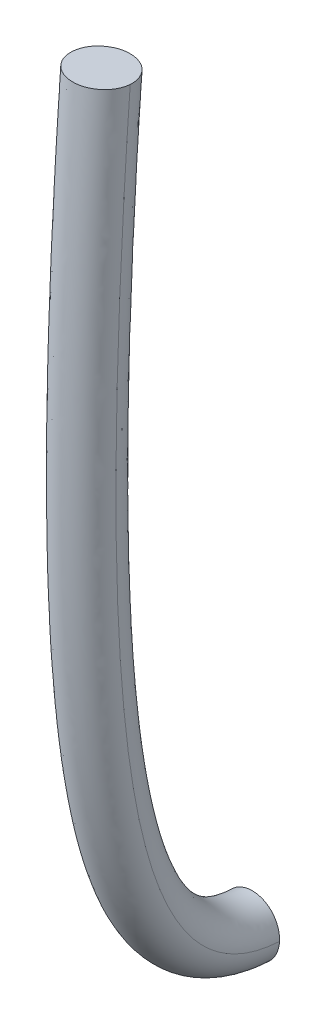
ISO-10303-21;
HEADER;
FILE_DESCRIPTION(('STEP AP214'),'2;1');
FILE_NAME('part.step','',(''),(''),'','','');
FILE_SCHEMA(('AUTOMOTIVE_DESIGN { 1 0 10303 214 1 1 1 1 }'));
ENDSEC;
DATA;
#1=APPLICATION_CONTEXT('core data for automotive mechanical design processes');
#2=APPLICATION_PROTOCOL_DEFINITION('international standard','automotive_design',2000,#1);
#3=PRODUCT_CONTEXT('',#1,'mechanical');
#4=PRODUCT('Part','Part','',(#3));
#5=PRODUCT_RELATED_PRODUCT_CATEGORY('part','',(#4));
#6=PRODUCT_DEFINITION_FORMATION('','',#4);
#7=PRODUCT_DEFINITION_CONTEXT('part definition',#1,'design');
#8=PRODUCT_DEFINITION('design','',#6,#7);
#9=PRODUCT_DEFINITION_SHAPE('','',#8);
#10=(LENGTH_UNIT() NAMED_UNIT(*) SI_UNIT(.MILLI.,.METRE.));
#11=(NAMED_UNIT(*) PLANE_ANGLE_UNIT() SI_UNIT($,.RADIAN.));
#12=(NAMED_UNIT(*) SI_UNIT($,.STERADIAN.) SOLID_ANGLE_UNIT());
#13=UNCERTAINTY_MEASURE_WITH_UNIT(LENGTH_MEASURE(1.E-05),#10,'distance_accuracy_value','');
#14=(GEOMETRIC_REPRESENTATION_CONTEXT(3) GLOBAL_UNCERTAINTY_ASSIGNED_CONTEXT((#13)) GLOBAL_UNIT_ASSIGNED_CONTEXT((#10,
#11,#12)) REPRESENTATION_CONTEXT('',''));
#15=CARTESIAN_POINT('',(0.,0.,0.));
#16=DIRECTION('',(0.,0.,1.));
#17=DIRECTION('',(1.,0.,0.));
#18=AXIS2_PLACEMENT_3D('',#15,#16,#17);
#19=CARTESIAN_POINT('',(11.2371049235898,-7.28816571650413,13.8273298935375));
#20=CARTESIAN_POINT('',(11.2371049235896,-7.2797997466397,13.9789788036062));
#21=CARTESIAN_POINT('',(11.2371049235894,-7.1925133259376,14.2453675982006));
#22=CARTESIAN_POINT('',(11.2371049235895,-6.82521048546997,14.5758359000025));
#23=CARTESIAN_POINT('',(11.2371049235899,-6.16592448523043,14.8229346231481));
#24=CARTESIAN_POINT('',(11.2371049235904,-5.06041775234898,14.9938908384421));
#25=CARTESIAN_POINT('',(11.2371049235907,-3.38308950930502,15.0377976387201));
#26=CARTESIAN_POINT('',(11.2371049235902,-1.84086868438424,14.9634808900407));
#27=CARTESIAN_POINT('',(11.2371049235898,-1.00711458056137,14.9025873102882));
#28=CARTESIAN_POINT('',(11.2662041019751,-7.22780337732114,13.8239999025055));
#29=CARTESIAN_POINT('',(11.2662041019749,-7.21999059608955,13.9656212300474));
#30=CARTESIAN_POINT('',(11.2662041019747,-7.14065188733595,14.2083397741127));
#31=CARTESIAN_POINT('',(11.2662041019748,-6.79718225096702,14.5207767317753));
#32=CARTESIAN_POINT('',(11.2662041019752,-6.15274272714041,14.7636344748142));
#33=CARTESIAN_POINT('',(11.2662041019757,-5.05672270192067,14.9333164200716));
#34=CARTESIAN_POINT('',(11.266204101976,-3.38439002120015,14.9773407944328));
#35=CARTESIAN_POINT('',(11.2662041019755,-1.84433184760095,14.9031186799958));
#36=CARTESIAN_POINT('',(11.2662041019751,-1.01151814356843,14.8422937827354));
#37=CARTESIAN_POINT('',(11.3827049364178,-7.13477011652102,13.8188675645554));
#38=CARTESIAN_POINT('',(11.3827049364176,-7.12780954728994,13.9450409496445));
#39=CARTESIAN_POINT('',(11.3827049364174,-7.06072585194706,14.1512792118558));
#40=CARTESIAN_POINT('',(11.3827049364175,-6.75397895160997,14.4359329395248));
#41=CARTESIAN_POINT('',(11.3827049364179,-6.13242027649786,14.6722480853013));
#42=CARTESIAN_POINT('',(11.3827049364184,-5.0510224207916,14.8399628111613));
#43=CARTESIAN_POINT('',(11.3827049364187,-3.3863895736968,14.8841652911233));
#44=CARTESIAN_POINT('',(11.3827049364182,-1.84967009667295,14.810085666427));
#45=CARTESIAN_POINT('',(11.3827049364178,-1.01830512086634,14.7493665776386));
#46=CARTESIAN_POINT('',(11.6006086827705,-7.18477681596076,13.821626269121));
#47=CARTESIAN_POINT('',(11.6006086827703,-7.17735890579916,13.956089817187));
#48=CARTESIAN_POINT('',(11.6006086827701,-7.10367730897485,14.1819340686278));
#49=CARTESIAN_POINT('',(11.6006086827703,-6.7772105672194,14.4815074345398));
#50=CARTESIAN_POINT('',(11.6006086827707,-6.14335544998786,14.7213510608364));
#51=CARTESIAN_POINT('',(11.6006086827711,-5.05409643294904,14.890129358683));
#52=CARTESIAN_POINT('',(11.6006086827714,-3.38532398400766,14.934241984418));
#53=CARTESIAN_POINT('',(11.600608682771,-1.84679946226505,14.8600921417049));
#54=CARTESIAN_POINT('',(11.6006086827705,-1.01465702414334,14.799316270631));
#55=CARTESIAN_POINT('',(11.6649999999986,-7.31847179552639,13.8290017798951));
#56=CARTESIAN_POINT('',(11.6649999999985,-7.30982729388697,13.9856996012998));
#57=CARTESIAN_POINT('',(11.6649999999983,-7.21856206356238,14.2639753932499));
#58=CARTESIAN_POINT('',(11.6649999999984,-6.83927265079749,14.6035120384916));
#59=CARTESIAN_POINT('',(11.6649999999988,-6.17253016770304,14.8527273660912));
#60=CARTESIAN_POINT('',(11.6649999999992,-5.06226210783719,15.024316706709));
#61=CARTESIAN_POINT('',(11.6649999999995,-3.38242664324033,15.0681581358356));
#62=CARTESIAN_POINT('',(11.6649999999991,-1.83913128396928,14.99378700265));
#63=CARTESIAN_POINT('',(11.6649999999986,-1.00490368664486,14.9328588411016));
#64=CARTESIAN_POINT('',(11.665,-7.38568943191456,13.8327099550486));
#65=CARTESIAN_POINT('',(11.6649999999998,-7.37642950308164,14.0005635497388));
#66=CARTESIAN_POINT('',(11.6649999999996,-7.27630544215443,14.3051956626326));
#67=CARTESIAN_POINT('',(11.6649999999997,-6.87049139059941,14.6648000911306));
#68=CARTESIAN_POINT('',(11.6650000000001,-6.18721819643525,14.9187474121089));
#69=CARTESIAN_POINT('',(11.6650000000006,-5.06638480515216,15.0917606586121));
#70=CARTESIAN_POINT('',(11.6650000000009,-3.38098577287837,15.1354758527534));
#71=CARTESIAN_POINT('',(11.6650000000004,-1.83527381521949,15.0610044224056));
#72=CARTESIAN_POINT('',(11.665,-1.00000001490137,14.9999998509838));
#73=B_SPLINE_SURFACE_WITH_KNOTS('',3,3,((#19,#20,#21,#22,#23,#24,#25,#26,#27),(#28,#29,#30,#31,
#32,#33,#34,#35,#36),(#37,#38,#39,#40,#41,#42,#43,#44,#45),(#46,#47,#48,#49,#50,#51,#52,#53,
#54),(#55,#56,#57,#58,#59,#60,#61,#62,#63),(#64,#65,#66,#67,#68,#69,#70,#71,#72)),.UNSPECIFIED.,
.F.,.F.,.F.,(4,1,1,4),(4,1,1,1,1,1,4),(0.448798950512828,1.34639685153848,2.24399475256414,
3.14159265358979),(0.,0.142857142857143,0.285714285714286,0.428571428571429,0.571428571428571,
0.785714285714286,1.),.UNSPECIFIED.);
#74=CARTESIAN_POINT('',(11.665,-7.38568943191456,13.8327099550486));
#75=CARTESIAN_POINT('',(11.6649999999998,-7.37642950308164,14.0005635497388));
#76=CARTESIAN_POINT('',(11.6649999999996,-7.27630544215443,14.3051956626326));
#77=CARTESIAN_POINT('',(11.6649999999997,-6.87049139059941,14.6648000911306));
#78=CARTESIAN_POINT('',(11.6650000000001,-6.18721819643525,14.9187474121089));
#79=CARTESIAN_POINT('',(11.6650000000006,-5.06638480515216,15.0917606586121));
#80=CARTESIAN_POINT('',(11.6650000000009,-3.38098577287837,15.1354758527534));
#81=CARTESIAN_POINT('',(11.6650000000004,-1.83527381521949,15.0610044224056));
#82=CARTESIAN_POINT('',(11.665,-1.00000001490137,14.9999998509838));
#83=B_SPLINE_CURVE_WITH_KNOTS('',3,(#74,#75,#76,#77,#78,#79,#80,#81,#82),.UNSPECIFIED.,.F.,.F.,
(4,1,1,1,1,1,4),(0.,0.142857142857143,0.285714285714286,0.428571428571429,0.571428571428571,
0.785714285714286,1.),.UNSPECIFIED.);
#84=CARTESIAN_POINT('',(11.665,-7.38568943191456,13.8327099550486));
#85=VERTEX_POINT('',#84);
#86=CARTESIAN_POINT('',(11.665,-1.00000001490137,14.9999998509838));
#87=VERTEX_POINT('',#86);
#88=EDGE_CURVE('E11',#85,#87,#83,.T.);
#89=CARTESIAN_POINT('',(11.665,-7.38568943191456,13.8327099550486));
#90=CARTESIAN_POINT('',(11.6650213517368,-7.41102547336946,13.8341076608363));
#91=CARTESIAN_POINT('',(11.6605260471071,-7.43643406147221,13.8355093687831));
#92=CARTESIAN_POINT('',(11.6435797747782,-7.48437927510819,13.8381543479804));
#93=CARTESIAN_POINT('',(11.631134036319,-7.50691777670614,13.8393977227271));
#94=CARTESIAN_POINT('',(11.5993172085098,-7.54640166593632,13.8415759185828));
#95=CARTESIAN_POINT('',(11.5799575825764,-7.56335622298759,13.8425112455383));
#96=CARTESIAN_POINT('',(11.5369135394507,-7.58996173161371,13.84397898364));
#97=CARTESIAN_POINT('',(11.513258328976,-7.59965986982189,13.844513997917));
#98=CARTESIAN_POINT('',(11.4639943449949,-7.61052238935641,13.8451132472689));
#99=CARTESIAN_POINT('',(11.4383805818065,-7.61166418738589,13.8451762364977));
#100=CARTESIAN_POINT('',(11.388111518271,-7.60564112333084,13.8448439639323));
#101=CARTESIAN_POINT('',(11.363457837558,-7.59846280382561,13.8444479597366));
#102=CARTESIAN_POINT('',(11.3179951823405,-7.57620559150138,13.8432201027906));
#103=CARTESIAN_POINT('',(11.2971918121944,-7.56111530281504,13.842387621368));
#104=CARTESIAN_POINT('',(11.2614934982136,-7.52495356613519,13.8403926977039));
#105=CARTESIAN_POINT('',(11.2466217840351,-7.50385914636031,13.8392289881852));
#106=CARTESIAN_POINT('',(11.2254441169844,-7.45822928099255,13.8367117391103));
#107=CARTESIAN_POINT('',(11.2189695929904,-7.43377282103522,13.8353625569309));
#108=CARTESIAN_POINT('',(11.2152068598672,-7.39652682447253,13.8333078182277));
#109=CARTESIAN_POINT('',(11.2149625619213,-7.38393344720673,13.8326130831672));
#110=CARTESIAN_POINT('',(11.2164976629928,-7.35885875176793,13.8312297949767));
#111=CARTESIAN_POINT('',(11.2182760419248,-7.34637738030605,13.8305412389069));
#112=CARTESIAN_POINT('',(11.2239943307244,-7.32135823772467,13.8291610153842));
#113=CARTESIAN_POINT('',(11.2280220095668,-7.30884017502639,13.8284704351799));
#114=CARTESIAN_POINT('',(11.2383339650418,-7.28477125009541,13.8271426320288));
#115=CARTESIAN_POINT('',(11.2446168141733,-7.27321978170879,13.8265053756426));
#116=CARTESIAN_POINT('',(11.2586120670738,-7.25220999709445,13.8253463351664));
#117=CARTESIAN_POINT('',(11.2661896726497,-7.24266098674344,13.824819547781));
#118=CARTESIAN_POINT('',(11.2827549049498,-7.22485207174111,13.8238370887171));
#119=CARTESIAN_POINT('',(11.2917444260656,-7.21659392920781,13.8233815142489));
#120=CARTESIAN_POINT('',(11.3114953717189,-7.20109430490341,13.8225264511312));
#121=CARTESIAN_POINT('',(11.3223324454482,-7.19394868777554,13.8221322510177));
#122=CARTESIAN_POINT('',(11.3450405271618,-7.18157498141827,13.8214496344763));
#123=CARTESIAN_POINT('',(11.3569100333437,-7.17634416274857,13.8211610674742));
#124=CARTESIAN_POINT('',(11.3813450105981,-7.16811399083132,13.8207070360526));
#125=CARTESIAN_POINT('',(11.3939068135744,-7.16510390182364,13.8205409793765));
#126=CARTESIAN_POINT('',(11.4193704073035,-7.16139691803755,13.8203364773156));
#127=CARTESIAN_POINT('',(11.4322724071987,-7.16070148130752,13.8202981123665));
#128=CARTESIAN_POINT('',(11.457288740886,-7.16145428672986,13.8203396421571));
#129=CARTESIAN_POINT('',(11.46940715121,-7.16278602640014,13.8204131098394));
#130=CARTESIAN_POINT('',(11.4932970110949,-7.16730641013266,13.8206624844909));
#131=CARTESIAN_POINT('',(11.505068279431,-7.17049600666694,13.8208384440047));
#132=CARTESIAN_POINT('',(11.5288787623782,-7.17899189700237,13.8213071342346));
#133=CARTESIAN_POINT('',(11.5408660748202,-7.18444510296073,13.8216079696095));
#134=CARTESIAN_POINT('',(11.563673404834,-7.19736897786271,13.8223209371337));
#135=CARTESIAN_POINT('',(11.5744950584494,-7.20483676624812,13.8227329103722));
#136=CARTESIAN_POINT('',(11.603546695065,-7.22919989306082,13.8240769436702));
#137=CARTESIAN_POINT('',(11.6197605726886,-7.24855818836156,13.8251448769315));
#138=CARTESIAN_POINT('',(11.6453568568894,-7.29145127115832,13.8275111467446));
#139=CARTESIAN_POINT('',(11.6546963115424,-7.31501119396303,13.8288108699282));
#140=CARTESIAN_POINT('',(11.6632711909135,-7.35460568155648,13.8309951671306));
#141=CARTESIAN_POINT('',(11.6649868906916,-7.37013388321011,13.8318518067663));
#142=CARTESIAN_POINT('',(11.665,-7.38568943191456,13.8327099550486));
#143=B_SPLINE_CURVE_WITH_KNOTS('',3,(#89,#90,#91,#92,#93,#94,#95,#96,#97,#98,#99,#100,#101,#102,
#103,#104,#105,#106,#107,#108,#109,#110,#111,#112,#113,#114,#115,#116,#117,#118,#119,#120,#121,
#122,#123,#124,#125,#126,#127,#128,#129,#130,#131,#132,#133,#134,#135,#136,#137,#138,#139,#140,
#141,#142),.UNSPECIFIED.,.T.,.F.,(4,2,2,2,2,2,2,2,2,2,2,2,2,2,2,2,2,2,2,2,2,2,2,2,2,2,4),(0.,
0.0759508765630466,0.151851849308873,0.227627555989026,0.302906124840257,0.378383311495008,
0.453982749710444,0.529691376609874,0.60569365045227,0.680145300255501,0.717869365306532,
0.755574413622481,0.794865355264611,0.83413146985316,0.870582209258705,0.907082279751547,
0.945864762005333,0.984591744679409,1.02313025868803,1.06169304433104,1.09812174529155,
1.13456913870207,1.17388682597308,1.21314858997431,1.2874777840451,1.36226753947678,
1.40889903720405),.UNSPECIFIED.);
#144=CARTESIAN_POINT('',(11.2371049235898,-7.28816571650413,13.8273298935375));
#145=VERTEX_POINT('',#144);
#146=EDGE_CURVE('E45',#145,#85,#143,.T.);
#147=CARTESIAN_POINT('',(11.2371049235898,-7.28816571650413,13.8273298935375));
#148=CARTESIAN_POINT('',(11.2371049235896,-7.2797997466397,13.9789788036062));
#149=CARTESIAN_POINT('',(11.2371049235894,-7.1925133259376,14.2453675982006));
#150=CARTESIAN_POINT('',(11.2371049235895,-6.82521048546997,14.5758359000025));
#151=CARTESIAN_POINT('',(11.2371049235899,-6.16592448523043,14.8229346231481));
#152=CARTESIAN_POINT('',(11.2371049235904,-5.06041775234898,14.9938908384421));
#153=CARTESIAN_POINT('',(11.2371049235907,-3.38308950930502,15.0377976387201));
#154=CARTESIAN_POINT('',(11.2371049235902,-1.84086868438424,14.9634808900407));
#155=CARTESIAN_POINT('',(11.2371049235898,-1.00711458056137,14.9025873102882));
#156=B_SPLINE_CURVE_WITH_KNOTS('',3,(#147,#148,#149,#150,#151,#152,#153,#154,#155),
.UNSPECIFIED.,.F.,.F.,(4,1,1,1,1,1,4),(0.,0.142857142857143,0.285714285714286,0.428571428571429,
0.571428571428571,0.785714285714286,1.),.UNSPECIFIED.);
#157=CARTESIAN_POINT('',(11.2371049235898,-1.00711458056137,14.9025873102882));
#158=VERTEX_POINT('',#157);
#159=EDGE_CURVE('E29',#145,#158,#156,.T.);
#160=CARTESIAN_POINT('',(11.665,-1.00000001490137,14.9999998509838));
#161=CARTESIAN_POINT('',(11.664989069257,-1.00092505034254,14.9873342777264));
#162=CARTESIAN_POINT('',(11.663848928742,-1.001850359016,14.9746649633762));
#163=CARTESIAN_POINT('',(11.659425462962,-1.00367493235908,14.9496829288383));
#164=CARTESIAN_POINT('',(11.6561370713378,-1.00457413020076,14.9373711236579));
#165=CARTESIAN_POINT('',(11.647607059914,-1.0063188635782,14.9134822568936));
#166=CARTESIAN_POINT('',(11.6423711225476,-1.00716454693694,14.9019031713193));
#167=CARTESIAN_POINT('',(11.6300891385912,-1.00878227676623,14.8797532354881));
#168=CARTESIAN_POINT('',(11.6230443601062,-1.00955437430694,14.8691816859795));
#169=CARTESIAN_POINT('',(11.6070374842247,-1.01102510155815,14.8490445075401));
#170=CARTESIAN_POINT('',(11.5980230501599,-1.01172073877358,14.839519851813));
#171=CARTESIAN_POINT('',(11.5783852566193,-1.01297820524407,14.8223026372158));
#172=CARTESIAN_POINT('',(11.5677629829274,-1.01354012414617,14.8146088508996));
#173=CARTESIAN_POINT('',(11.5461093974645,-1.01448288567522,14.8017005722773));
#174=CARTESIAN_POINT('',(11.5351581867197,-1.01487361876511,14.7963506598808));
#175=CARTESIAN_POINT('',(11.5125390719713,-1.01552589678584,14.787419677685));
#176=CARTESIAN_POINT('',(11.5008702067087,-1.01578726400625,14.7838410410946));
#177=CARTESIAN_POINT('',(11.4763880374062,-1.01618718663221,14.7783653056895));
#178=CARTESIAN_POINT('',(11.4635484111283,-1.0163172402786,14.7765846128508));
#179=CARTESIAN_POINT('',(11.4377637334483,-1.0164191768623,14.7751888984698));
#180=CARTESIAN_POINT('',(11.4248188560558,-1.01639128237659,14.7755708294061));
#181=CARTESIAN_POINT('',(11.3992406018496,-1.01616740285514,14.778636184909));
#182=CARTESIAN_POINT('',(11.3866063452266,-1.01597196749224,14.7813120833621));
#183=CARTESIAN_POINT('',(11.3620289221829,-1.01541796968436,14.7888974141592));
#184=CARTESIAN_POINT('',(11.3500861686932,-1.01505931088015,14.7938081658525));
#185=CARTESIAN_POINT('',(11.3278358721695,-1.01422561313129,14.8052231446121));
#186=CARTESIAN_POINT('',(11.3174743964508,-1.0137581205502,14.8116240469663));
#187=CARTESIAN_POINT('',(11.2978624558736,-1.01271191458275,14.8259486854973));
#188=CARTESIAN_POINT('',(11.2886126331452,-1.01213313741152,14.8338732950158));
#189=CARTESIAN_POINT('',(11.2707691231984,-1.01082708383549,14.8517557636317));
#190=CARTESIAN_POINT('',(11.2622872012945,-1.01009162968852,14.8618255922689));
#191=CARTESIAN_POINT('',(11.2472443139223,-1.00852502701184,14.8832754957901));
#192=CARTESIAN_POINT('',(11.2406805294172,-1.00769402144199,14.8946536132694));
#193=CARTESIAN_POINT('',(11.2249108019623,-1.00517402040839,14.9291574347224));
#194=CARTESIAN_POINT('',(11.2185998483193,-1.00338291611532,14.9536812114621));
#195=CARTESIAN_POINT('',(11.2151303433721,-1.00066660076836,14.9908729659459));
#196=CARTESIAN_POINT('',(11.2149849442764,-0.999752500313406,15.0033888175139));
#197=CARTESIAN_POINT('',(11.2166922085396,-0.99793330127797,15.0282972671013));
#198=CARTESIAN_POINT('',(11.2185435732397,-0.997028197232558,15.0406899399465));
#199=CARTESIAN_POINT('',(11.2243964780868,-0.995209128478521,15.0655966057227));
#200=CARTESIAN_POINT('',(11.2284973834539,-0.99429684057041,15.0780876399228));
#201=CARTESIAN_POINT('',(11.2389362572408,-0.992542663595455,15.1021058083018));
#202=CARTESIAN_POINT('',(11.2452739053244,-0.991700764469191,15.1136330802142));
#203=CARTESIAN_POINT('',(11.2594126605321,-0.990164688008278,15.1346650191849));
#204=CARTESIAN_POINT('',(11.2670910744706,-0.989464452645206,15.1442526326899));
#205=CARTESIAN_POINT('',(11.2838843083192,-0.988161973942015,15.162086154193));
#206=CARTESIAN_POINT('',(11.2929996883405,-0.987559768999749,15.1703315364483));
#207=CARTESIAN_POINT('',(11.3128590171333,-0.98644519700304,15.1855922417645));
#208=CARTESIAN_POINT('',(11.3236564048542,-0.985937851071557,15.1925388156751));
#209=CARTESIAN_POINT('',(11.3462967414489,-0.985068017376844,15.204448567336));
#210=CARTESIAN_POINT('',(11.3581393030179,-0.984705476226927,15.2094124760563));
#211=CARTESIAN_POINT('',(11.382246109602,-0.984138155209565,15.2171802280644));
#212=CARTESIAN_POINT('',(11.3944969661488,-0.983930330422163,15.2200257623567));
#213=CARTESIAN_POINT('',(11.4193020972807,-0.983662412965591,15.2236940846954));
#214=CARTESIAN_POINT('',(11.4318564720421,-0.983602369762967,15.2245161954465));
#215=CARTESIAN_POINT('',(11.4572586032347,-0.983633599608907,15.224088596801));
#216=CARTESIAN_POINT('',(11.4701056127997,-0.983728798832261,15.22278513027));
#217=CARTESIAN_POINT('',(11.4953659372665,-0.984082612802076,15.2179407139862));
#218=CARTESIAN_POINT('',(11.5077793754626,-0.984341180685668,15.2144004058791));
#219=CARTESIAN_POINT('',(11.5314502069663,-0.98499874886832,15.2053969908546));
#220=CARTESIAN_POINT('',(11.5427311393556,-0.98539329214593,15.199994909417));
#221=CARTESIAN_POINT('',(11.564264949044,-0.986310602055021,15.1874351140445));
#222=CARTESIAN_POINT('',(11.5745176297513,-0.986833393140665,15.1802770652835));
#223=CARTESIAN_POINT('',(11.593950405898,-0.988010405584494,15.1641614261752));
#224=CARTESIAN_POINT('',(11.603096283974,-0.988667651560121,15.1551624228052));
#225=CARTESIAN_POINT('',(11.6196665976134,-0.990087183508968,15.1357262097812));
#226=CARTESIAN_POINT('',(11.6270911337549,-0.990849463340906,15.1252890842135));
#227=CARTESIAN_POINT('',(11.6462018629208,-0.993218131276973,15.0928573135683));
#228=CARTESIAN_POINT('',(11.6552960705372,-0.994942140778152,15.0692521978487));
#229=CARTESIAN_POINT('',(11.6634285988756,-0.997799967859161,15.0301228665382));
#230=CARTESIAN_POINT('',(11.665013000785,-0.998899798120339,15.0150640048733));
#231=CARTESIAN_POINT('',(11.665,-1.00000001490137,14.9999998509838));
#232=B_SPLINE_CURVE_WITH_KNOTS('',3,(#160,#161,#162,#163,#164,#165,#166,#167,#168,#169,#170,
#171,#172,#173,#174,#175,#176,#177,#178,#179,#180,#181,#182,#183,#184,#185,#186,#187,#188,#189,
#190,#191,#192,#193,#194,#195,#196,#197,#198,#199,#200,#201,#202,#203,#204,#205,#206,#207,#208,
#209,#210,#211,#212,#213,#214,#215,#216,#217,#218,#219,#220,#221,#222,#223,#224,#225,#226,#227,
#228,#229,#230,#231),.UNSPECIFIED.,.T.,.F.,(4,2,2,2,2,2,2,2,2,2,2,2,2,2,2,2,2,2,2,2,2,2,2,2,2,2,
2,2,2,2,2,2,2,2,2,4),(0.,0.0380604694484833,0.0762110249795806,0.114251129285625,
0.152264637692989,0.191448096188545,0.230605210946061,0.267033341893636,0.303511376387559,
0.342223454897622,0.380880994794789,0.419412189209357,0.457966160142759,0.494384704742079,
0.530824185883836,0.570180115105823,0.609477909646733,0.683955710902255,0.72149633892016,
0.759012565910028,0.79833760644077,0.837657017300324,0.874407068771903,0.911171480532556,
0.949528328400366,0.98787102176725,1.02543756540801,1.06301668189151,1.10156101925322,
1.14009430505466,1.17746879110629,1.21485040923395,1.25318993224531,1.29152721451308,
1.36604985316959,1.41131813729929),.UNSPECIFIED.);
#233=EDGE_CURVE('E48',#87,#158,#232,.T.);
#234=ORIENTED_EDGE('',*,*,#88,.F.);
#235=ORIENTED_EDGE('',*,*,#146,.F.);
#236=ORIENTED_EDGE('',*,*,#159,.T.);
#237=ORIENTED_EDGE('',*,*,#233,.F.);
#238=EDGE_LOOP('',(#234,#235,#236,#237));
#239=FACE_BOUND('',#238,.T.);
#240=ADVANCED_FACE('F17',(#239),#73,.F.);
#241=CARTESIAN_POINT('',(11.44,-1.00000001490116,14.9999998509884));
#242=DIRECTION('',(5.3263280686712E-13,-0.997343536648528,0.0728414024124084));
#243=DIRECTION('',(0.,-0.0728414024124084,-0.997343536648528));
#244=AXIS2_PLACEMENT_3D('',#241,#242,#243);
#245=PLANE('',#244);
#246=ORIENTED_EDGE('',*,*,#233,.T.);
#247=EDGE_CURVE('E80',#158,#87,#232,.T.);
#248=ORIENTED_EDGE('',*,*,#247,.T.);
#249=EDGE_LOOP('',(#246,#248));
#250=FACE_BOUND('',#249,.T.);
#251=ADVANCED_FACE('F72',(#250),#245,.F.);
#252=CARTESIAN_POINT('',(11.44,-7.38568943191911,13.8327099550486));
#253=DIRECTION('',(1.11236968520861E-12,-0.0550829445172842,-0.998481782118886));
#254=DIRECTION('',(0.,0.998481782118886,-0.0550829445172842));
#255=AXIS2_PLACEMENT_3D('',#252,#253,#254);
#256=PLANE('',#255);
#257=EDGE_CURVE('E52',#85,#145,#143,.T.);
#258=ORIENTED_EDGE('',*,*,#257,.T.);
#259=ORIENTED_EDGE('',*,*,#146,.T.);
#260=EDGE_LOOP('',(#258,#259));
#261=FACE_BOUND('',#260,.T.);
#262=ADVANCED_FACE('F51',(#261),#256,.T.);
#263=CARTESIAN_POINT('',(11.665,-7.38568943191456,13.8327099550486));
#264=CARTESIAN_POINT('',(11.6649999999998,-7.37642950308164,14.0005635497388));
#265=CARTESIAN_POINT('',(11.6649999999996,-7.27630544215443,14.3051956626326));
#266=CARTESIAN_POINT('',(11.6649999999997,-6.87049139059941,14.6648000911306));
#267=CARTESIAN_POINT('',(11.6650000000001,-6.18721819643525,14.9187474121089));
#268=CARTESIAN_POINT('',(11.6650000000006,-5.06638480515216,15.0917606586121));
#269=CARTESIAN_POINT('',(11.6650000000009,-3.38098577287837,15.1354758527534));
#270=CARTESIAN_POINT('',(11.6650000000004,-1.83527381521949,15.0610044224056));
#271=CARTESIAN_POINT('',(11.665,-1.00000001490137,14.9999998509838));
#272=CARTESIAN_POINT('',(11.665000000001,-7.43610265920569,13.8354910864138));
#273=CARTESIAN_POINT('',(11.6650000000008,-7.42638032085317,14.0117267217746));
#274=CARTESIAN_POINT('',(11.6650000000006,-7.31962430235271,14.3361291351454));
#275=CARTESIAN_POINT('',(11.6650000000007,-6.89389491152955,14.710800658563));
#276=CARTESIAN_POINT('',(11.6650000000011,-6.19822101400784,14.968283571986));
#277=CARTESIAN_POINT('',(11.6650000000016,-5.06946537914156,15.1423577123384));
#278=CARTESIAN_POINT('',(11.6650000000019,-3.3798946206723,15.1859715183366));
#279=CARTESIAN_POINT('',(11.6650000000015,-1.83238214013707,15.1114175914059));
#280=CARTESIAN_POINT('',(11.665000000001,-0.996322261093759,15.0503556083956));
#281=CARTESIAN_POINT('',(11.6414633018091,-7.50310171191513,13.8391872030272));
#282=CARTESIAN_POINT('',(11.6414633018089,-7.49276525026042,14.0265549761955));
#283=CARTESIAN_POINT('',(11.6414633018087,-7.37718931976729,14.3772305459226));
#284=CARTESIAN_POINT('',(11.6414633018088,-6.92500337690199,14.7719181063135));
#285=CARTESIAN_POINT('',(11.6414633018092,-6.2128503050899,15.0341064862272));
#286=CARTESIAN_POINT('',(11.6414633018097,-5.07356515457458,15.2095940547722));
#287=CARTESIAN_POINT('',(11.64146330181,-3.37844970967196,15.2530764579613));
#288=CARTESIAN_POINT('',(11.6414633018095,-1.82853840097273,15.1784165147751));
#289=CARTESIAN_POINT('',(11.6414633018091,-0.991434535501723,15.1172782837793));
#290=CARTESIAN_POINT('',(11.5694818501216,-7.57470732316592,13.8431374482718));
#291=CARTESIAN_POINT('',(11.5694818501214,-7.56371511541546,14.0423918505237));
#292=CARTESIAN_POINT('',(11.5694818501212,-7.43870413284674,14.4211448089423));
#293=CARTESIAN_POINT('',(11.5694818501213,-6.95825827504006,14.8372129647174));
#294=CARTESIAN_POINT('',(11.5694818501217,-6.22849490808792,15.104439947145));
#295=CARTESIAN_POINT('',(11.5694818501222,-5.07795502076836,15.2814431690871));
#296=CARTESIAN_POINT('',(11.5694818501225,-3.37691298052956,15.3247899468771));
#297=CARTESIAN_POINT('',(11.569481850122,-1.8244293605917,15.2500219130986));
#298=CARTESIAN_POINT('',(11.5694818501216,-0.986210751515401,15.1888022663373));
#299=CARTESIAN_POINT('',(11.4761648389801,-7.61993875270833,13.8456327169571));
#300=CARTESIAN_POINT('',(11.4761648389799,-7.6085314683873,14.0524111613161));
#301=CARTESIAN_POINT('',(11.4761648389797,-7.47757305247355,14.4489030172777));
#302=CARTESIAN_POINT('',(11.4761648389798,-6.97925376395426,14.8784933813885));
#303=CARTESIAN_POINT('',(11.4761648389802,-6.23836369295199,15.1488894067665));
#304=CARTESIAN_POINT('',(11.4761648389807,-5.08071627246877,15.326842829537));
#305=CARTESIAN_POINT('',(11.476164838981,-3.37593152540468,15.3700970688178));
#306=CARTESIAN_POINT('',(11.4761648389806,-1.82183524461988,15.2952533147378));
#307=CARTESIAN_POINT('',(11.4761648389801,-0.982911021044658,15.2339821331264));
#308=CARTESIAN_POINT('',(11.3349484752791,-7.60399674867495,13.8447532492096));
#309=CARTESIAN_POINT('',(11.3349484752789,-7.59273594740845,14.0488764131983));
#310=CARTESIAN_POINT('',(11.3349484752787,-7.46387100909782,14.4391154374283));
#311=CARTESIAN_POINT('',(11.3349484752788,-6.97185617230864,14.8639362086966));
#312=CARTESIAN_POINT('',(11.3349484752792,-6.23488835102114,15.1332182882384));
#313=CARTESIAN_POINT('',(11.3349484752797,-5.07974561757483,15.310838381754));
#314=CARTESIAN_POINT('',(11.33494847528,-3.37627979068458,15.3541267372021));
#315=CARTESIAN_POINT('',(11.3349484752795,-1.82274923258165,15.2793112972466));
#316=CARTESIAN_POINT('',(11.3349484752791,-0.984074024668687,15.2180583025983));
#317=CARTESIAN_POINT('',(11.208096850993,-7.47839213962746,13.8378240574754));
#318=CARTESIAN_POINT('',(11.2080968509928,-7.46828250641575,14.0210801392681));
#319=CARTESIAN_POINT('',(11.2080968509926,-7.35595451867977,14.3620648146218));
#320=CARTESIAN_POINT('',(11.2080968509927,-6.91353465379583,14.7493638388059));
#321=CARTESIAN_POINT('',(11.2080968509931,-6.20746025232329,15.009822199827));
#322=CARTESIAN_POINT('',(11.2080968509936,-5.07205773328847,15.184791313313));
#323=CARTESIAN_POINT('',(11.2080968509939,-3.37898681421146,15.2283248726171));
#324=CARTESIAN_POINT('',(11.2080968509935,-1.82995541784707,15.1537069483699));
#325=CARTESIAN_POINT('',(11.208096850993,-0.993237152165247,15.092596879816));
#326=CARTESIAN_POINT('',(11.2080057452044,-7.34852805568711,13.8306598845696));
#327=CARTESIAN_POINT('',(11.2080057452042,-7.33960889718986,13.992336377165));
#328=CARTESIAN_POINT('',(11.208005745204,-7.24437476453926,14.2823954222886));
#329=CARTESIAN_POINT('',(11.2080057452041,-6.85323871997292,14.6308950682297));
#330=CARTESIAN_POINT('',(11.2080057452045,-6.17910624332045,14.882234771482));
#331=CARTESIAN_POINT('',(11.208005745205,-5.0641128027773,15.0544652568126));
#332=CARTESIAN_POINT('',(11.2080057452053,-3.38178899740988,15.0982544830074));
#333=CARTESIAN_POINT('',(11.2080057452049,-1.83740552116754,15.0238431000855));
#334=CARTESIAN_POINT('',(11.2080057452044,-1.0027110175543,14.962880837841));
#335=CARTESIAN_POINT('',(11.2371049235898,-7.28816571650413,13.8273298935375));
#336=CARTESIAN_POINT('',(11.2371049235896,-7.2797997466397,13.9789788036062));
#337=CARTESIAN_POINT('',(11.2371049235894,-7.1925133259376,14.2453675982006));
#338=CARTESIAN_POINT('',(11.2371049235895,-6.82521048546997,14.5758359000025));
#339=CARTESIAN_POINT('',(11.2371049235899,-6.16592448523043,14.8229346231481));
#340=CARTESIAN_POINT('',(11.2371049235904,-5.06041775234898,14.9938908384421));
#341=CARTESIAN_POINT('',(11.2371049235907,-3.38308950930502,15.0377976387201));
#342=CARTESIAN_POINT('',(11.2371049235902,-1.84086868438424,14.9634808900407));
#343=CARTESIAN_POINT('',(11.2371049235898,-1.00711458056137,14.9025873102882));
#344=B_SPLINE_SURFACE_WITH_KNOTS('',3,3,((#263,#264,#265,#266,#267,#268,#269,#270,#271),(#272,
#273,#274,#275,#276,#277,#278,#279,#280),(#281,#282,#283,#284,#285,#286,#287,#288,#289),(#290,
#291,#292,#293,#294,#295,#296,#297,#298),(#299,#300,#301,#302,#303,#304,#305,#306,#307),(#308,
#309,#310,#311,#312,#313,#314,#315,#316),(#317,#318,#319,#320,#321,#322,#323,#324,#325),(#326,
#327,#328,#329,#330,#331,#332,#333,#334),(#335,#336,#337,#338,#339,#340,#341,#342,#343)),
.UNSPECIFIED.,.F.,.F.,.F.,(4,1,1,1,1,1,4),(4,1,1,1,1,1,4),(-3.14159265358979,-2.46839422782055,
-2.24399475256414,-1.79519580205131,-1.12199737628207,-0.448798950512828,0.448798950512828),(0.,
0.142857142857143,0.285714285714286,0.428571428571429,0.571428571428571,0.785714285714286,1.),.UNSPECIFIED.);
#345=ORIENTED_EDGE('',*,*,#257,.F.);
#346=ORIENTED_EDGE('',*,*,#88,.T.);
#347=ORIENTED_EDGE('',*,*,#247,.F.);
#348=ORIENTED_EDGE('',*,*,#159,.F.);
#349=EDGE_LOOP('',(#345,#346,#347,#348));
#350=FACE_BOUND('',#349,.T.);
#351=ADVANCED_FACE('F54',(#350),#344,.F.);
#352=CLOSED_SHELL('',(#240,#251,#262,#351));
#353=MANIFOLD_SOLID_BREP('B1',#352);
#354=ADVANCED_BREP_SHAPE_REPRESENTATION('',(#18,#353),#14);
#355=SHAPE_DEFINITION_REPRESENTATION(#9,#354);
ENDSEC;
END-ISO-10303-21;
